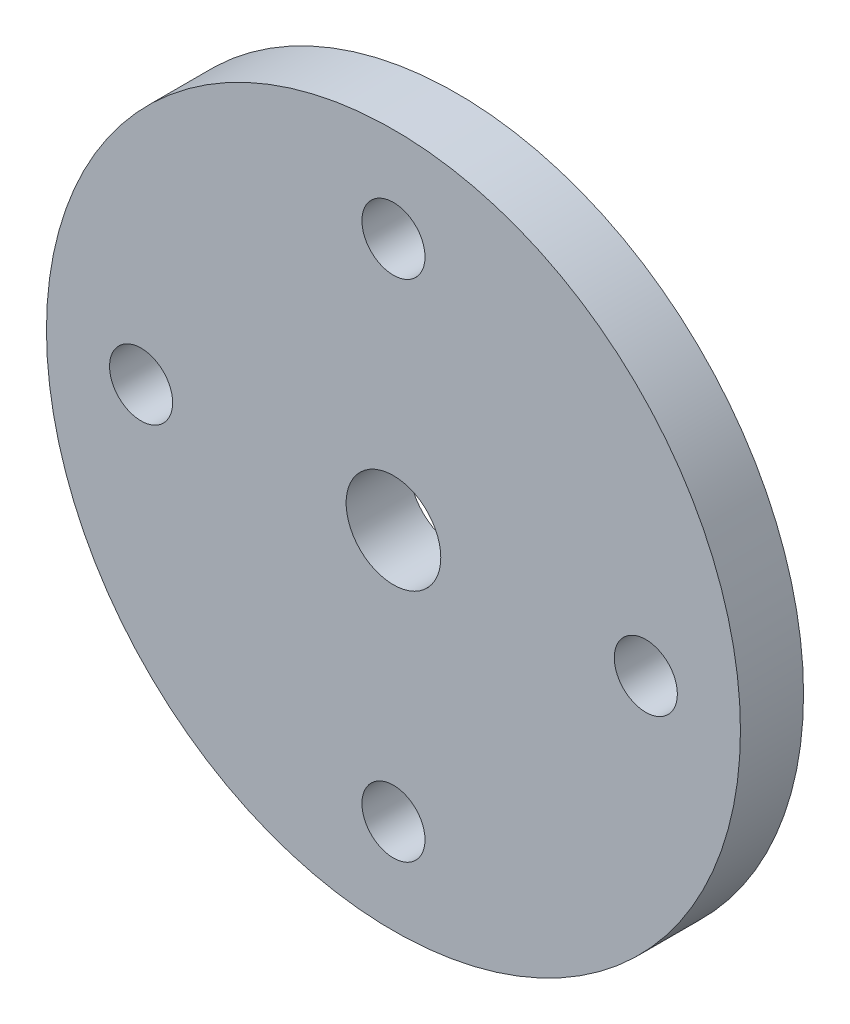
ISO-10303-21;
HEADER;
FILE_DESCRIPTION(('STEP AP214'),'2;1');
FILE_NAME('part.step','',(''),(''),'','','');
FILE_SCHEMA(('AUTOMOTIVE_DESIGN { 1 0 10303 214 1 1 1 1 }'));
ENDSEC;
DATA;
#1=APPLICATION_CONTEXT('core data for automotive mechanical design processes');
#2=APPLICATION_PROTOCOL_DEFINITION('international standard','automotive_design',2000,#1);
#3=PRODUCT_CONTEXT('',#1,'mechanical');
#4=PRODUCT('Part','Part','',(#3));
#5=PRODUCT_RELATED_PRODUCT_CATEGORY('part','',(#4));
#6=PRODUCT_DEFINITION_FORMATION('','',#4);
#7=PRODUCT_DEFINITION_CONTEXT('part definition',#1,'design');
#8=PRODUCT_DEFINITION('design','',#6,#7);
#9=PRODUCT_DEFINITION_SHAPE('','',#8);
#10=(LENGTH_UNIT() NAMED_UNIT(*) SI_UNIT(.MILLI.,.METRE.));
#11=(NAMED_UNIT(*) PLANE_ANGLE_UNIT() SI_UNIT($,.RADIAN.));
#12=(NAMED_UNIT(*) SI_UNIT($,.STERADIAN.) SOLID_ANGLE_UNIT());
#13=UNCERTAINTY_MEASURE_WITH_UNIT(LENGTH_MEASURE(1.E-05),#10,'distance_accuracy_value','');
#14=(GEOMETRIC_REPRESENTATION_CONTEXT(3) GLOBAL_UNCERTAINTY_ASSIGNED_CONTEXT((#13)) GLOBAL_UNIT_ASSIGNED_CONTEXT((#10,
#11,#12)) REPRESENTATION_CONTEXT('',''));
#15=CARTESIAN_POINT('',(0.,0.,0.));
#16=DIRECTION('',(0.,0.,1.));
#17=DIRECTION('',(1.,0.,0.));
#18=AXIS2_PLACEMENT_3D('',#15,#16,#17);
#19=CARTESIAN_POINT('',(0.,0.,2.));
#20=DIRECTION('',(0.,0.,1.));
#21=DIRECTION('',(1.,0.,0.));
#22=AXIS2_PLACEMENT_3D('',#19,#20,#21);
#23=PLANE('',#22);
#24=CARTESIAN_POINT('',(0.,-8.,2.));
#25=DIRECTION('',(0.,0.,1.));
#26=DIRECTION('',(1.,0.,0.));
#27=AXIS2_PLACEMENT_3D('',#24,#25,#26);
#28=CIRCLE('',#27,1.);
#29=CARTESIAN_POINT('',(1.,-8.,2.));
#30=VERTEX_POINT('',#29);
#31=EDGE_CURVE('E78',#30,#30,#28,.T.);
#32=ORIENTED_EDGE('',*,*,#31,.F.);
#33=EDGE_LOOP('',(#32));
#34=FACE_BOUND('',#33,.T.);
#35=CARTESIAN_POINT('',(0.,0.,2.));
#36=DIRECTION('',(0.,0.,1.));
#37=DIRECTION('',(1.,0.,0.));
#38=AXIS2_PLACEMENT_3D('',#35,#36,#37);
#39=CIRCLE('',#38,1.5);
#40=CARTESIAN_POINT('',(1.5,0.,2.));
#41=VERTEX_POINT('',#40);
#42=EDGE_CURVE('E62',#41,#41,#39,.T.);
#43=ORIENTED_EDGE('',*,*,#42,.F.);
#44=EDGE_LOOP('',(#43));
#45=FACE_BOUND('',#44,.T.);
#46=CARTESIAN_POINT('',(0.,0.,2.));
#47=DIRECTION('',(0.,0.,1.));
#48=DIRECTION('',(1.,0.,0.));
#49=AXIS2_PLACEMENT_3D('',#46,#47,#48);
#50=CIRCLE('',#49,11.);
#51=CARTESIAN_POINT('',(11.,0.,2.));
#52=VERTEX_POINT('',#51);
#53=EDGE_CURVE('E10',#52,#52,#50,.T.);
#54=ORIENTED_EDGE('',*,*,#53,.T.);
#55=EDGE_LOOP('',(#54));
#56=FACE_BOUND('',#55,.T.);
#57=CARTESIAN_POINT('',(0.,8.,2.));
#58=DIRECTION('',(0.,0.,1.));
#59=DIRECTION('',(1.,0.,0.));
#60=AXIS2_PLACEMENT_3D('',#57,#58,#59);
#61=CIRCLE('',#60,1.);
#62=CARTESIAN_POINT('',(1.,8.,2.));
#63=VERTEX_POINT('',#62);
#64=EDGE_CURVE('E56',#63,#63,#61,.T.);
#65=ORIENTED_EDGE('',*,*,#64,.F.);
#66=EDGE_LOOP('',(#65));
#67=FACE_BOUND('',#66,.T.);
#68=CARTESIAN_POINT('',(8.,0.,2.));
#69=DIRECTION('',(0.,0.,1.));
#70=DIRECTION('',(1.,0.,0.));
#71=AXIS2_PLACEMENT_3D('',#68,#69,#70);
#72=CIRCLE('',#71,1.);
#73=CARTESIAN_POINT('',(9.,0.,2.));
#74=VERTEX_POINT('',#73);
#75=EDGE_CURVE('E70',#74,#74,#72,.T.);
#76=ORIENTED_EDGE('',*,*,#75,.F.);
#77=EDGE_LOOP('',(#76));
#78=FACE_BOUND('',#77,.T.);
#79=CARTESIAN_POINT('',(-8.,0.,2.));
#80=DIRECTION('',(0.,0.,1.));
#81=DIRECTION('',(1.,0.,0.));
#82=AXIS2_PLACEMENT_3D('',#79,#80,#81);
#83=CIRCLE('',#82,1.);
#84=CARTESIAN_POINT('',(-7.,0.,2.));
#85=VERTEX_POINT('',#84);
#86=EDGE_CURVE('E86',#85,#85,#83,.T.);
#87=ORIENTED_EDGE('',*,*,#86,.F.);
#88=EDGE_LOOP('',(#87));
#89=FACE_BOUND('',#88,.T.);
#90=ADVANCED_FACE('F43',(#34,#45,#56,#67,#78,#89),#23,.T.);
#91=CARTESIAN_POINT('',(0.,0.,0.));
#92=DIRECTION('',(0.,0.,1.));
#93=DIRECTION('',(1.,0.,0.));
#94=AXIS2_PLACEMENT_3D('',#91,#92,#93);
#95=PLANE('',#94);
#96=CARTESIAN_POINT('',(0.,0.,0.));
#97=DIRECTION('',(0.,0.,1.));
#98=DIRECTION('',(1.,0.,0.));
#99=AXIS2_PLACEMENT_3D('',#96,#97,#98);
#100=CIRCLE('',#99,11.);
#101=CARTESIAN_POINT('',(11.,0.,0.));
#102=VERTEX_POINT('',#101);
#103=EDGE_CURVE('E47',#102,#102,#100,.T.);
#104=ORIENTED_EDGE('',*,*,#103,.F.);
#105=EDGE_LOOP('',(#104));
#106=FACE_BOUND('',#105,.T.);
#107=CARTESIAN_POINT('',(0.,8.,0.));
#108=DIRECTION('',(0.,0.,1.));
#109=DIRECTION('',(1.,0.,0.));
#110=AXIS2_PLACEMENT_3D('',#107,#108,#109);
#111=CIRCLE('',#110,1.);
#112=CARTESIAN_POINT('',(1.,8.,0.));
#113=VERTEX_POINT('',#112);
#114=EDGE_CURVE('E58',#113,#113,#111,.T.);
#115=ORIENTED_EDGE('',*,*,#114,.T.);
#116=EDGE_LOOP('',(#115));
#117=FACE_BOUND('',#116,.T.);
#118=CARTESIAN_POINT('',(0.,0.,0.));
#119=DIRECTION('',(0.,0.,1.));
#120=DIRECTION('',(1.,0.,0.));
#121=AXIS2_PLACEMENT_3D('',#118,#119,#120);
#122=CIRCLE('',#121,1.5);
#123=CARTESIAN_POINT('',(1.5,0.,0.));
#124=VERTEX_POINT('',#123);
#125=EDGE_CURVE('E66',#124,#124,#122,.T.);
#126=ORIENTED_EDGE('',*,*,#125,.T.);
#127=EDGE_LOOP('',(#126));
#128=FACE_BOUND('',#127,.T.);
#129=CARTESIAN_POINT('',(8.,0.,0.));
#130=DIRECTION('',(0.,0.,1.));
#131=DIRECTION('',(1.,0.,0.));
#132=AXIS2_PLACEMENT_3D('',#129,#130,#131);
#133=CIRCLE('',#132,1.);
#134=CARTESIAN_POINT('',(9.,0.,0.));
#135=VERTEX_POINT('',#134);
#136=EDGE_CURVE('E74',#135,#135,#133,.T.);
#137=ORIENTED_EDGE('',*,*,#136,.T.);
#138=EDGE_LOOP('',(#137));
#139=FACE_BOUND('',#138,.T.);
#140=CARTESIAN_POINT('',(0.,-8.,0.));
#141=DIRECTION('',(0.,0.,1.));
#142=DIRECTION('',(1.,0.,0.));
#143=AXIS2_PLACEMENT_3D('',#140,#141,#142);
#144=CIRCLE('',#143,1.);
#145=CARTESIAN_POINT('',(1.,-8.,0.));
#146=VERTEX_POINT('',#145);
#147=EDGE_CURVE('E82',#146,#146,#144,.T.);
#148=ORIENTED_EDGE('',*,*,#147,.T.);
#149=EDGE_LOOP('',(#148));
#150=FACE_BOUND('',#149,.T.);
#151=CARTESIAN_POINT('',(-8.,0.,0.));
#152=DIRECTION('',(0.,0.,1.));
#153=DIRECTION('',(1.,0.,0.));
#154=AXIS2_PLACEMENT_3D('',#151,#152,#153);
#155=CIRCLE('',#154,1.);
#156=CARTESIAN_POINT('',(-7.,0.,0.));
#157=VERTEX_POINT('',#156);
#158=EDGE_CURVE('E90',#157,#157,#155,.T.);
#159=ORIENTED_EDGE('',*,*,#158,.T.);
#160=EDGE_LOOP('',(#159));
#161=FACE_BOUND('',#160,.T.);
#162=ADVANCED_FACE('F102',(#106,#117,#128,#139,#150,#161),#95,.F.);
#163=CARTESIAN_POINT('',(0.,0.,2.));
#164=DIRECTION('',(0.,0.,-1.));
#165=DIRECTION('',(-1.,0.,0.));
#166=AXIS2_PLACEMENT_3D('',#163,#164,#165);
#167=CYLINDRICAL_SURFACE('',#166,11.);
#168=ORIENTED_EDGE('',*,*,#53,.F.);
#169=EDGE_LOOP('',(#168));
#170=FACE_BOUND('',#169,.T.);
#171=ORIENTED_EDGE('',*,*,#103,.T.);
#172=EDGE_LOOP('',(#171));
#173=FACE_BOUND('',#172,.T.);
#174=ADVANCED_FACE('F45',(#170,#173),#167,.T.);
#175=CARTESIAN_POINT('',(0.,8.,2.));
#176=DIRECTION('',(0.,0.,-1.));
#177=DIRECTION('',(-1.,0.,0.));
#178=AXIS2_PLACEMENT_3D('',#175,#176,#177);
#179=CYLINDRICAL_SURFACE('',#178,1.);
#180=ORIENTED_EDGE('',*,*,#64,.T.);
#181=EDGE_LOOP('',(#180));
#182=FACE_BOUND('',#181,.T.);
#183=ORIENTED_EDGE('',*,*,#114,.F.);
#184=EDGE_LOOP('',(#183));
#185=FACE_BOUND('',#184,.T.);
#186=ADVANCED_FACE('F112',(#182,#185),#179,.F.);
#187=CARTESIAN_POINT('',(0.,0.,2.));
#188=DIRECTION('',(0.,0.,-1.));
#189=DIRECTION('',(-1.,0.,0.));
#190=AXIS2_PLACEMENT_3D('',#187,#188,#189);
#191=CYLINDRICAL_SURFACE('',#190,1.5);
#192=ORIENTED_EDGE('',*,*,#42,.T.);
#193=EDGE_LOOP('',(#192));
#194=FACE_BOUND('',#193,.T.);
#195=ORIENTED_EDGE('',*,*,#125,.F.);
#196=EDGE_LOOP('',(#195));
#197=FACE_BOUND('',#196,.T.);
#198=ADVANCED_FACE('F115',(#194,#197),#191,.F.);
#199=CARTESIAN_POINT('',(8.,0.,2.));
#200=DIRECTION('',(0.,0.,-1.));
#201=DIRECTION('',(-1.,0.,0.));
#202=AXIS2_PLACEMENT_3D('',#199,#200,#201);
#203=CYLINDRICAL_SURFACE('',#202,1.);
#204=ORIENTED_EDGE('',*,*,#75,.T.);
#205=EDGE_LOOP('',(#204));
#206=FACE_BOUND('',#205,.T.);
#207=ORIENTED_EDGE('',*,*,#136,.F.);
#208=EDGE_LOOP('',(#207));
#209=FACE_BOUND('',#208,.T.);
#210=ADVANCED_FACE('F119',(#206,#209),#203,.F.);
#211=CARTESIAN_POINT('',(0.,-8.,2.));
#212=DIRECTION('',(0.,0.,-1.));
#213=DIRECTION('',(-1.,0.,0.));
#214=AXIS2_PLACEMENT_3D('',#211,#212,#213);
#215=CYLINDRICAL_SURFACE('',#214,1.);
#216=ORIENTED_EDGE('',*,*,#31,.T.);
#217=EDGE_LOOP('',(#216));
#218=FACE_BOUND('',#217,.T.);
#219=ORIENTED_EDGE('',*,*,#147,.F.);
#220=EDGE_LOOP('',(#219));
#221=FACE_BOUND('',#220,.T.);
#222=ADVANCED_FACE('F123',(#218,#221),#215,.F.);
#223=CARTESIAN_POINT('',(-8.,0.,2.));
#224=DIRECTION('',(0.,0.,-1.));
#225=DIRECTION('',(-1.,0.,0.));
#226=AXIS2_PLACEMENT_3D('',#223,#224,#225);
#227=CYLINDRICAL_SURFACE('',#226,1.);
#228=ORIENTED_EDGE('',*,*,#86,.T.);
#229=EDGE_LOOP('',(#228));
#230=FACE_BOUND('',#229,.T.);
#231=ORIENTED_EDGE('',*,*,#158,.F.);
#232=EDGE_LOOP('',(#231));
#233=FACE_BOUND('',#232,.T.);
#234=ADVANCED_FACE('F98',(#230,#233),#227,.F.);
#235=CLOSED_SHELL('',(#90,#162,#174,#186,#198,#210,#222,#234));
#236=MANIFOLD_SOLID_BREP('B2',#235);
#237=ADVANCED_BREP_SHAPE_REPRESENTATION('',(#18,#236),#14);
#238=SHAPE_DEFINITION_REPRESENTATION(#9,#237);
ENDSEC;
END-ISO-10303-21;
